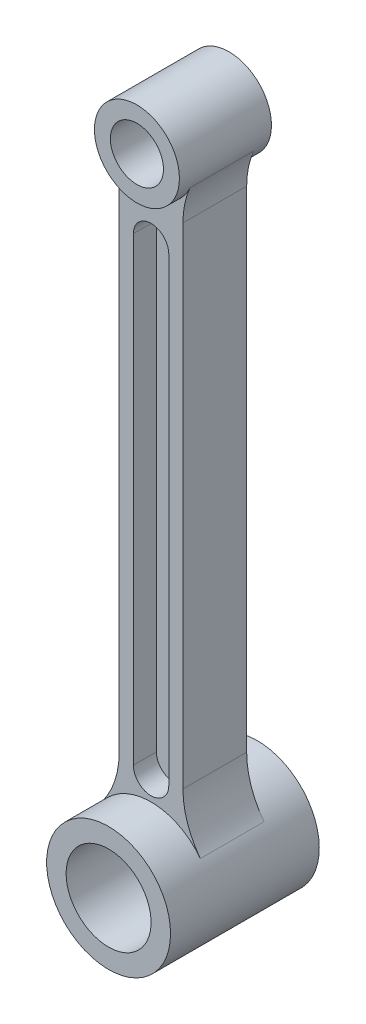
ISO-10303-21;
HEADER;
FILE_DESCRIPTION(('STEP AP214'),'2;1');
FILE_NAME('part.step','',(''),(''),'','','');
FILE_SCHEMA(('AUTOMOTIVE_DESIGN { 1 0 10303 214 1 1 1 1 }'));
ENDSEC;
DATA;
#1=APPLICATION_CONTEXT('core data for automotive mechanical design processes');
#2=APPLICATION_PROTOCOL_DEFINITION('international standard','automotive_design',2000,#1);
#3=PRODUCT_CONTEXT('',#1,'mechanical');
#4=PRODUCT('Part','Part','',(#3));
#5=PRODUCT_RELATED_PRODUCT_CATEGORY('part','',(#4));
#6=PRODUCT_DEFINITION_FORMATION('','',#4);
#7=PRODUCT_DEFINITION_CONTEXT('part definition',#1,'design');
#8=PRODUCT_DEFINITION('design','',#6,#7);
#9=PRODUCT_DEFINITION_SHAPE('','',#8);
#10=(LENGTH_UNIT() NAMED_UNIT(*) SI_UNIT(.MILLI.,.METRE.));
#11=(NAMED_UNIT(*) PLANE_ANGLE_UNIT() SI_UNIT($,.RADIAN.));
#12=(NAMED_UNIT(*) SI_UNIT($,.STERADIAN.) SOLID_ANGLE_UNIT());
#13=UNCERTAINTY_MEASURE_WITH_UNIT(LENGTH_MEASURE(1.E-05),#10,'distance_accuracy_value','');
#14=(GEOMETRIC_REPRESENTATION_CONTEXT(3) GLOBAL_UNCERTAINTY_ASSIGNED_CONTEXT((#13)) GLOBAL_UNIT_ASSIGNED_CONTEXT((#10,
#11,#12)) REPRESENTATION_CONTEXT('',''));
#15=CARTESIAN_POINT('',(0.,0.,0.));
#16=DIRECTION('',(0.,0.,1.));
#17=DIRECTION('',(1.,0.,0.));
#18=AXIS2_PLACEMENT_3D('',#15,#16,#17);
#19=CARTESIAN_POINT('',(0.,154.,9.));
#20=DIRECTION('',(0.,0.,-1.));
#21=DIRECTION('',(-1.,0.,0.));
#22=AXIS2_PLACEMENT_3D('',#19,#20,#21);
#23=CYLINDRICAL_SURFACE('',#22,5.);
#24=DIRECTION('',(0.,0.,-1.));
#25=VECTOR('',#24,1.);
#26=CARTESIAN_POINT('',(4.99999999999998,154.,9.));
#27=LINE('',#26,#25);
#28=CARTESIAN_POINT('',(4.99999999999998,154.,-2.5));
#29=VERTEX_POINT('',#28);
#30=CARTESIAN_POINT('',(4.99999999999998,154.,-9.));
#31=VERTEX_POINT('',#30);
#32=EDGE_CURVE('E182',#29,#31,#27,.T.);
#33=ORIENTED_EDGE('',*,*,#32,.F.);
#34=CARTESIAN_POINT('',(0.,154.,-2.5));
#35=DIRECTION('',(0.,0.,1.));
#36=DIRECTION('',(1.,0.,0.));
#37=AXIS2_PLACEMENT_3D('',#34,#35,#36);
#38=CIRCLE('',#37,5.);
#39=CARTESIAN_POINT('',(-5.00000000000002,154.,-2.5));
#40=VERTEX_POINT('',#39);
#41=EDGE_CURVE('E581',#29,#40,#38,.T.);
#42=ORIENTED_EDGE('',*,*,#41,.T.);
#43=DIRECTION('',(0.,0.,-1.));
#44=VECTOR('',#43,1.);
#45=CARTESIAN_POINT('',(-5.00000000000002,154.,9.));
#46=LINE('',#45,#44);
#47=CARTESIAN_POINT('',(-5.00000000000002,154.,-9.));
#48=VERTEX_POINT('',#47);
#49=EDGE_CURVE('E210',#40,#48,#46,.T.);
#50=ORIENTED_EDGE('',*,*,#49,.T.);
#51=CARTESIAN_POINT('',(0.,154.,-9.));
#52=DIRECTION('',(0.,0.,1.));
#53=DIRECTION('',(1.,0.,0.));
#54=AXIS2_PLACEMENT_3D('',#51,#52,#53);
#55=CIRCLE('',#54,5.);
#56=EDGE_CURVE('E232',#31,#48,#55,.T.);
#57=ORIENTED_EDGE('',*,*,#56,.F.);
#58=EDGE_LOOP('',(#33,#42,#50,#57));
#59=FACE_BOUND('',#58,.T.);
#60=ADVANCED_FACE('F41',(#59),#23,.F.);
#61=CARTESIAN_POINT('',(5.,0.,9.));
#62=DIRECTION('',(-1.,0.,0.));
#63=DIRECTION('',(0.,-1.,0.));
#64=AXIS2_PLACEMENT_3D('',#61,#62,#63);
#65=PLANE('',#64);
#66=DIRECTION('',(0.,0.,-1.));
#67=VECTOR('',#66,1.);
#68=CARTESIAN_POINT('',(5.,24.,9.));
#69=LINE('',#68,#67);
#70=CARTESIAN_POINT('',(5.,24.,-2.5));
#71=VERTEX_POINT('',#70);
#72=CARTESIAN_POINT('',(5.,24.,-9.));
#73=VERTEX_POINT('',#72);
#74=EDGE_CURVE('E213',#71,#73,#69,.T.);
#75=ORIENTED_EDGE('',*,*,#74,.F.);
#76=DIRECTION('',(0.,1.,0.));
#77=VECTOR('',#76,1.);
#78=CARTESIAN_POINT('',(5.,0.,-2.5));
#79=LINE('',#78,#77);
#80=EDGE_CURVE('E58',#71,#29,#79,.T.);
#81=ORIENTED_EDGE('',*,*,#80,.T.);
#82=ORIENTED_EDGE('',*,*,#32,.T.);
#83=DIRECTION('',(0.,1.,0.));
#84=VECTOR('',#83,1.);
#85=CARTESIAN_POINT('',(5.,0.,-9.));
#86=LINE('',#85,#84);
#87=EDGE_CURVE('E237',#73,#31,#86,.T.);
#88=ORIENTED_EDGE('',*,*,#87,.F.);
#89=EDGE_LOOP('',(#75,#81,#82,#88));
#90=FACE_BOUND('',#89,.T.);
#91=ADVANCED_FACE('F355',(#90),#65,.T.);
#92=CARTESIAN_POINT('',(0.,24.,9.));
#93=DIRECTION('',(0.,0.,-1.));
#94=DIRECTION('',(-1.,0.,0.));
#95=AXIS2_PLACEMENT_3D('',#92,#93,#94);
#96=CYLINDRICAL_SURFACE('',#95,5.);
#97=DIRECTION('',(0.,0.,-1.));
#98=VECTOR('',#97,1.);
#99=CARTESIAN_POINT('',(-5.,24.,9.));
#100=LINE('',#99,#98);
#101=CARTESIAN_POINT('',(-5.,24.,-2.5));
#102=VERTEX_POINT('',#101);
#103=CARTESIAN_POINT('',(-5.,24.,-9.));
#104=VERTEX_POINT('',#103);
#105=EDGE_CURVE('E209',#102,#104,#100,.T.);
#106=ORIENTED_EDGE('',*,*,#105,.F.);
#107=CARTESIAN_POINT('',(0.,24.,-2.5));
#108=DIRECTION('',(0.,0.,1.));
#109=DIRECTION('',(1.,0.,0.));
#110=AXIS2_PLACEMENT_3D('',#107,#108,#109);
#111=CIRCLE('',#110,5.);
#112=EDGE_CURVE('E66',#102,#71,#111,.T.);
#113=ORIENTED_EDGE('',*,*,#112,.T.);
#114=ORIENTED_EDGE('',*,*,#74,.T.);
#115=CARTESIAN_POINT('',(0.,24.,-9.));
#116=DIRECTION('',(0.,0.,1.));
#117=DIRECTION('',(1.,0.,0.));
#118=AXIS2_PLACEMENT_3D('',#115,#116,#117);
#119=CIRCLE('',#118,5.);
#120=EDGE_CURVE('E230',#104,#73,#119,.T.);
#121=ORIENTED_EDGE('',*,*,#120,.F.);
#122=EDGE_LOOP('',(#106,#113,#114,#121));
#123=FACE_BOUND('',#122,.T.);
#124=ADVANCED_FACE('F235',(#123),#96,.F.);
#125=CARTESIAN_POINT('',(-5.,0.,9.));
#126=DIRECTION('',(-1.,0.,0.));
#127=DIRECTION('',(0.,-1.,0.));
#128=AXIS2_PLACEMENT_3D('',#125,#126,#127);
#129=PLANE('',#128);
#130=DIRECTION('',(0.,1.,0.));
#131=VECTOR('',#130,1.);
#132=CARTESIAN_POINT('',(-5.,0.,-2.5));
#133=LINE('',#132,#131);
#134=EDGE_CURVE('E223',#102,#40,#133,.T.);
#135=ORIENTED_EDGE('',*,*,#134,.F.);
#136=ORIENTED_EDGE('',*,*,#105,.T.);
#137=DIRECTION('',(0.,1.,0.));
#138=VECTOR('',#137,1.);
#139=CARTESIAN_POINT('',(-5.,0.,-9.));
#140=LINE('',#139,#138);
#141=EDGE_CURVE('E220',#104,#48,#140,.T.);
#142=ORIENTED_EDGE('',*,*,#141,.T.);
#143=ORIENTED_EDGE('',*,*,#49,.F.);
#144=EDGE_LOOP('',(#135,#136,#142,#143));
#145=FACE_BOUND('',#144,.T.);
#146=ADVANCED_FACE('F219',(#145),#129,.F.);
#147=CARTESIAN_POINT('',(0.,0.,21.));
#148=DIRECTION('',(0.,0.,-1.));
#149=DIRECTION('',(-1.,0.,0.));
#150=AXIS2_PLACEMENT_3D('',#147,#148,#149);
#151=CYLINDRICAL_SURFACE('',#150,12.);
#152=CARTESIAN_POINT('',(0.,0.,21.));
#153=DIRECTION('',(0.,0.,1.));
#154=DIRECTION('',(1.,0.,0.));
#155=AXIS2_PLACEMENT_3D('',#152,#153,#154);
#156=CIRCLE('',#155,12.);
#157=CARTESIAN_POINT('',(-12.,0.,21.));
#158=VERTEX_POINT('',#157);
#159=EDGE_CURVE('E50',#158,#158,#156,.T.);
#160=CARTESIAN_POINT('',(0.,0.,-21.));
#161=DIRECTION('',(0.,0.,1.));
#162=DIRECTION('',(1.,0.,0.));
#163=AXIS2_PLACEMENT_3D('',#160,#161,#162);
#164=CIRCLE('',#163,12.);
#165=CARTESIAN_POINT('',(-12.,0.,-21.));
#166=VERTEX_POINT('',#165);
#167=EDGE_CURVE('E192',#166,#166,#164,.T.);
#168=CARTESIAN_POINT('',(-12.,0.,21.));
#169=CARTESIAN_POINT('',(-12.,0.,20.5625));
#170=CARTESIAN_POINT('',(-12.,0.,20.125));
#171=CARTESIAN_POINT('',(-12.,0.,19.25));
#172=CARTESIAN_POINT('',(-12.,0.,18.8125));
#173=CARTESIAN_POINT('',(-12.,0.,17.9375));
#174=CARTESIAN_POINT('',(-12.,0.,17.5));
#175=CARTESIAN_POINT('',(-12.,0.,16.625));
#176=CARTESIAN_POINT('',(-12.,0.,16.1875));
#177=CARTESIAN_POINT('',(-12.,0.,15.3125));
#178=CARTESIAN_POINT('',(-12.,0.,14.875));
#179=CARTESIAN_POINT('',(-12.,0.,14.));
#180=CARTESIAN_POINT('',(-12.,0.,13.5625));
#181=CARTESIAN_POINT('',(-12.,0.,12.6875));
#182=CARTESIAN_POINT('',(-12.,0.,12.25));
#183=CARTESIAN_POINT('',(-12.,0.,11.375));
#184=CARTESIAN_POINT('',(-12.,0.,10.9375));
#185=CARTESIAN_POINT('',(-12.,0.,10.0625));
#186=CARTESIAN_POINT('',(-12.,0.,9.625));
#187=CARTESIAN_POINT('',(-12.,0.,8.75));
#188=CARTESIAN_POINT('',(-12.,0.,8.3125));
#189=CARTESIAN_POINT('',(-12.,0.,7.4375));
#190=CARTESIAN_POINT('',(-12.,0.,7.));
#191=CARTESIAN_POINT('',(-12.,0.,6.125));
#192=CARTESIAN_POINT('',(-12.,0.,5.6875));
#193=CARTESIAN_POINT('',(-12.,0.,4.8125));
#194=CARTESIAN_POINT('',(-12.,0.,4.375));
#195=CARTESIAN_POINT('',(-12.,0.,3.5));
#196=CARTESIAN_POINT('',(-12.,0.,3.0625));
#197=CARTESIAN_POINT('',(-12.,0.,2.1875));
#198=CARTESIAN_POINT('',(-12.,0.,1.75));
#199=CARTESIAN_POINT('',(-12.,0.,0.874999999999997));
#200=CARTESIAN_POINT('',(-12.,0.,0.437499999999997));
#201=CARTESIAN_POINT('',(-12.,0.,-0.437500000000004));
#202=CARTESIAN_POINT('',(-12.,0.,-0.875000000000004));
#203=CARTESIAN_POINT('',(-12.,0.,-1.75000000000001));
#204=CARTESIAN_POINT('',(-12.,0.,-2.18750000000001));
#205=CARTESIAN_POINT('',(-12.,0.,-3.0625));
#206=CARTESIAN_POINT('',(-12.,0.,-3.5));
#207=CARTESIAN_POINT('',(-12.,0.,-4.375));
#208=CARTESIAN_POINT('',(-12.,0.,-4.8125));
#209=CARTESIAN_POINT('',(-12.,0.,-5.68750000000001));
#210=CARTESIAN_POINT('',(-12.,0.,-6.12500000000001));
#211=CARTESIAN_POINT('',(-12.,0.,-7.00000000000001));
#212=CARTESIAN_POINT('',(-12.,0.,-7.4375));
#213=CARTESIAN_POINT('',(-12.,0.,-8.3125));
#214=CARTESIAN_POINT('',(-12.,0.,-8.75));
#215=CARTESIAN_POINT('',(-12.,0.,-9.625));
#216=CARTESIAN_POINT('',(-12.,0.,-10.0625));
#217=CARTESIAN_POINT('',(-12.,0.,-10.9375));
#218=CARTESIAN_POINT('',(-12.,0.,-11.375));
#219=CARTESIAN_POINT('',(-12.,0.,-12.25));
#220=CARTESIAN_POINT('',(-12.,0.,-12.6875));
#221=CARTESIAN_POINT('',(-12.,0.,-13.5625));
#222=CARTESIAN_POINT('',(-12.,0.,-14.));
#223=CARTESIAN_POINT('',(-12.,0.,-14.875));
#224=CARTESIAN_POINT('',(-12.,0.,-15.3125));
#225=CARTESIAN_POINT('',(-12.,0.,-16.1875));
#226=CARTESIAN_POINT('',(-12.,0.,-16.625));
#227=CARTESIAN_POINT('',(-12.,0.,-17.5));
#228=CARTESIAN_POINT('',(-12.,0.,-17.9375));
#229=CARTESIAN_POINT('',(-12.,0.,-18.8125));
#230=CARTESIAN_POINT('',(-12.,0.,-19.25));
#231=CARTESIAN_POINT('',(-12.,0.,-20.125));
#232=CARTESIAN_POINT('',(-12.,0.,-20.5625));
#233=CARTESIAN_POINT('',(-12.,0.,-21.));
#234=B_SPLINE_CURVE_WITH_KNOTS('',3,(#168,#169,#170,#171,#172,#173,#174,#175,#176,#177,#178,
#179,#180,#181,#182,#183,#184,#185,#186,#187,#188,#189,#190,#191,#192,#193,#194,#195,#196,#197,
#198,#199,#200,#201,#202,#203,#204,#205,#206,#207,#208,#209,#210,#211,#212,#213,#214,#215,#216,
#217,#218,#219,#220,#221,#222,#223,#224,#225,#226,#227,#228,#229,#230,#231,#232,#233),
.UNSPECIFIED.,.F.,.F.,(4,2,2,2,2,2,2,2,2,2,2,2,2,2,2,2,2,2,2,2,2,2,2,2,2,2,2,2,2,2,2,2,4),(0.,
1.3125,2.625,3.9375,5.25,6.5625,7.875,9.1875,10.5,11.8125,13.125,14.4375,15.75,17.0625,18.375,
19.6875,21.,22.3125,23.625,24.9375,26.25,27.5625,28.875,30.1875,31.5,32.8125,34.125,35.4375,
36.75,38.0625,39.375,40.6875,42.),.UNSPECIFIED.);
#235=EDGE_CURVE('BSEAM43',#158,#166,#234,.T.);
#236=ORIENTED_EDGE('',*,*,#159,.T.);
#237=ORIENTED_EDGE('',*,*,#167,.F.);
#238=ORIENTED_EDGE('',*,*,#235,.T.);
#239=ORIENTED_EDGE('',*,*,#235,.F.);
#240=EDGE_LOOP('',(#236,#238,#237,#239));
#241=FACE_BOUND('',#240,.T.);
#242=ADVANCED_FACE('F43',(#241),#151,.F.);
#243=CARTESIAN_POINT('',(0.,0.,21.));
#244=DIRECTION('',(0.,0.,-1.));
#245=DIRECTION('',(-1.,0.,0.));
#246=AXIS2_PLACEMENT_3D('',#243,#244,#245);
#247=CYLINDRICAL_SURFACE('',#246,17.5);
#248=DIRECTION('',(0.,0.,-1.));
#249=VECTOR('',#248,1.);
#250=CARTESIAN_POINT('',(13.9156626506024,10.6115188825459,9.));
#251=LINE('',#250,#249);
#252=CARTESIAN_POINT('',(13.9156626506024,10.6115188825459,9.));
#253=VERTEX_POINT('',#252);
#254=CARTESIAN_POINT('',(13.9156626506024,10.6115188825459,-9.));
#255=VERTEX_POINT('',#254);
#256=EDGE_CURVE('E185',#253,#255,#251,.T.);
#257=ORIENTED_EDGE('',*,*,#256,.F.);
#258=CARTESIAN_POINT('',(0.,0.,9.));
#259=DIRECTION('',(0.,0.,1.));
#260=DIRECTION('',(1.,0.,0.));
#261=AXIS2_PLACEMENT_3D('',#258,#259,#260);
#262=CIRCLE('',#261,17.5);
#263=CARTESIAN_POINT('',(-13.9156626506024,10.611518882546,9.));
#264=VERTEX_POINT('',#263);
#265=EDGE_CURVE('E302',#253,#264,#262,.T.);
#266=ORIENTED_EDGE('',*,*,#265,.T.);
#267=DIRECTION('',(0.,0.,-1.));
#268=VECTOR('',#267,1.);
#269=CARTESIAN_POINT('',(-13.9156626506024,10.6115188825459,9.));
#270=LINE('',#269,#268);
#271=CARTESIAN_POINT('',(-13.9156626506024,10.6115188825459,-9.));
#272=VERTEX_POINT('',#271);
#273=EDGE_CURVE('E265',#264,#272,#270,.T.);
#274=ORIENTED_EDGE('',*,*,#273,.T.);
#275=CARTESIAN_POINT('',(0.,0.,-9.));
#276=DIRECTION('',(0.,0.,1.));
#277=DIRECTION('',(1.,0.,0.));
#278=AXIS2_PLACEMENT_3D('',#275,#276,#277);
#279=CIRCLE('',#278,17.5);
#280=EDGE_CURVE('E257',#255,#272,#279,.T.);
#281=ORIENTED_EDGE('',*,*,#280,.F.);
#282=EDGE_LOOP('',(#257,#266,#274,#281));
#283=FACE_BOUND('',#282,.T.);
#284=CARTESIAN_POINT('',(0.,0.,21.));
#285=DIRECTION('',(0.,0.,1.));
#286=DIRECTION('',(1.,0.,0.));
#287=AXIS2_PLACEMENT_3D('',#284,#285,#286);
#288=CIRCLE('',#287,17.5);
#289=CARTESIAN_POINT('',(17.5,0.,21.));
#290=VERTEX_POINT('',#289);
#291=EDGE_CURVE('E11',#290,#290,#288,.T.);
#292=ORIENTED_EDGE('',*,*,#291,.F.);
#293=EDGE_LOOP('',(#292));
#294=FACE_BOUND('',#293,.T.);
#295=CARTESIAN_POINT('',(0.,0.,-21.));
#296=DIRECTION('',(0.,0.,1.));
#297=DIRECTION('',(1.,0.,0.));
#298=AXIS2_PLACEMENT_3D('',#295,#296,#297);
#299=CIRCLE('',#298,17.5);
#300=CARTESIAN_POINT('',(17.5,0.,-21.));
#301=VERTEX_POINT('',#300);
#302=EDGE_CURVE('E45',#301,#301,#299,.T.);
#303=ORIENTED_EDGE('',*,*,#302,.T.);
#304=EDGE_LOOP('',(#303));
#305=FACE_BOUND('',#304,.T.);
#306=ADVANCED_FACE('F404',(#283,#294,#305),#247,.T.);
#307=CARTESIAN_POINT('',(0.,0.,21.));
#308=DIRECTION('',(0.,0.,1.));
#309=DIRECTION('',(1.,0.,0.));
#310=AXIS2_PLACEMENT_3D('',#307,#308,#309);
#311=PLANE('',#310);
#312=ORIENTED_EDGE('',*,*,#159,.F.);
#313=EDGE_LOOP('',(#312));
#314=FACE_BOUND('',#313,.T.);
#315=ORIENTED_EDGE('',*,*,#291,.T.);
#316=EDGE_LOOP('',(#315));
#317=FACE_BOUND('',#316,.T.);
#318=ADVANCED_FACE('F410',(#314,#317),#311,.T.);
#319=CARTESIAN_POINT('',(0.,0.,-21.));
#320=DIRECTION('',(0.,0.,1.));
#321=DIRECTION('',(1.,0.,0.));
#322=AXIS2_PLACEMENT_3D('',#319,#320,#321);
#323=PLANE('',#322);
#324=ORIENTED_EDGE('',*,*,#167,.T.);
#325=EDGE_LOOP('',(#324));
#326=FACE_BOUND('',#325,.T.);
#327=ORIENTED_EDGE('',*,*,#302,.F.);
#328=EDGE_LOOP('',(#327));
#329=FACE_BOUND('',#328,.T.);
#330=ADVANCED_FACE('F389',(#326,#329),#323,.F.);
#331=CARTESIAN_POINT('',(9.,0.,9.));
#332=DIRECTION('',(-1.,0.,0.));
#333=DIRECTION('',(0.,0.,1.));
#334=AXIS2_PLACEMENT_3D('',#331,#332,#333);
#335=PLANE('',#334);
#336=DIRECTION('',(0.,1.,0.));
#337=VECTOR('',#336,1.);
#338=CARTESIAN_POINT('',(9.,0.,-9.));
#339=LINE('',#338,#337);
#340=CARTESIAN_POINT('',(9.,25.1644590643232,-9.));
#341=VERTEX_POINT('',#340);
#342=CARTESIAN_POINT('',(9.,163.612505430062,-9.));
#343=VERTEX_POINT('',#342);
#344=EDGE_CURVE('E233',#341,#343,#339,.T.);
#345=ORIENTED_EDGE('',*,*,#344,.T.);
#346=DIRECTION('',(0.,0.,-1.));
#347=VECTOR('',#346,1.);
#348=CARTESIAN_POINT('',(9.,163.612505430062,9.));
#349=LINE('',#348,#347);
#350=CARTESIAN_POINT('',(9.,163.612505430062,9.));
#351=VERTEX_POINT('',#350);
#352=EDGE_CURVE('E194',#351,#343,#349,.T.);
#353=ORIENTED_EDGE('',*,*,#352,.F.);
#354=DIRECTION('',(0.,1.,0.));
#355=VECTOR('',#354,1.);
#356=CARTESIAN_POINT('',(9.,0.,9.));
#357=LINE('',#356,#355);
#358=CARTESIAN_POINT('',(9.,25.1644590643232,9.));
#359=VERTEX_POINT('',#358);
#360=EDGE_CURVE('E328',#359,#351,#357,.T.);
#361=ORIENTED_EDGE('',*,*,#360,.F.);
#362=DIRECTION('',(0.,0.,-1.));
#363=VECTOR('',#362,1.);
#364=CARTESIAN_POINT('',(9.,25.1644590643232,9.));
#365=LINE('',#364,#363);
#366=EDGE_CURVE('E181',#359,#341,#365,.T.);
#367=ORIENTED_EDGE('',*,*,#366,.T.);
#368=EDGE_LOOP('',(#345,#353,#361,#367));
#369=FACE_BOUND('',#368,.T.);
#370=ADVANCED_FACE('F386',(#369),#335,.F.);
#371=CARTESIAN_POINT('',(33.,163.612505430062,9.));
#372=DIRECTION('',(0.,0.,-1.));
#373=DIRECTION('',(-1.,0.,0.));
#374=AXIS2_PLACEMENT_3D('',#371,#372,#373);
#375=CYLINDRICAL_SURFACE('',#374,24.);
#376=CARTESIAN_POINT('',(33.,163.612505430062,-9.));
#377=DIRECTION('',(0.,0.,1.));
#378=DIRECTION('',(1.,0.,0.));
#379=AXIS2_PLACEMENT_3D('',#376,#377,#378);
#380=CIRCLE('',#379,24.);
#381=CARTESIAN_POINT('',(11.,173.204168476687,-9.));
#382=VERTEX_POINT('',#381);
#383=EDGE_CURVE('E243',#343,#382,#380,.F.);
#384=ORIENTED_EDGE('',*,*,#383,.T.);
#385=DIRECTION('',(0.,0.,-1.));
#386=VECTOR('',#385,1.);
#387=CARTESIAN_POINT('',(11.,173.204168476687,9.));
#388=LINE('',#387,#386);
#389=CARTESIAN_POINT('',(11.,173.204168476687,9.));
#390=VERTEX_POINT('',#389);
#391=EDGE_CURVE('E199',#390,#382,#388,.T.);
#392=ORIENTED_EDGE('',*,*,#391,.F.);
#393=CARTESIAN_POINT('',(33.,163.612505430062,9.));
#394=DIRECTION('',(0.,0.,1.));
#395=DIRECTION('',(1.,0.,0.));
#396=AXIS2_PLACEMENT_3D('',#393,#394,#395);
#397=CIRCLE('',#396,24.);
#398=EDGE_CURVE('E297',#351,#390,#397,.F.);
#399=ORIENTED_EDGE('',*,*,#398,.F.);
#400=ORIENTED_EDGE('',*,*,#352,.T.);
#401=EDGE_LOOP('',(#384,#392,#399,#400));
#402=FACE_BOUND('',#401,.T.);
#403=ADVANCED_FACE('F331',(#402),#375,.F.);
#404=CARTESIAN_POINT('',(-33.,163.612505430062,9.));
#405=DIRECTION('',(0.,0.,-1.));
#406=DIRECTION('',(-1.,0.,0.));
#407=AXIS2_PLACEMENT_3D('',#404,#405,#406);
#408=CYLINDRICAL_SURFACE('',#407,24.);
#409=CARTESIAN_POINT('',(-33.,163.612505430062,-9.));
#410=DIRECTION('',(0.,0.,1.));
#411=DIRECTION('',(1.,0.,0.));
#412=AXIS2_PLACEMENT_3D('',#409,#410,#411);
#413=CIRCLE('',#412,24.);
#414=CARTESIAN_POINT('',(-9.,163.612505430062,-9.));
#415=VERTEX_POINT('',#414);
#416=CARTESIAN_POINT('',(-11.,173.204168476687,-9.));
#417=VERTEX_POINT('',#416);
#418=EDGE_CURVE('E248',#415,#417,#413,.T.);
#419=ORIENTED_EDGE('',*,*,#418,.F.);
#420=DIRECTION('',(0.,0.,-1.));
#421=VECTOR('',#420,1.);
#422=CARTESIAN_POINT('',(-9.,163.612505430062,9.));
#423=LINE('',#422,#421);
#424=CARTESIAN_POINT('',(-9.,163.612505430062,9.));
#425=VERTEX_POINT('',#424);
#426=EDGE_CURVE('E269',#425,#415,#423,.T.);
#427=ORIENTED_EDGE('',*,*,#426,.F.);
#428=CARTESIAN_POINT('',(-33.,163.612505430062,9.));
#429=DIRECTION('',(0.,0.,1.));
#430=DIRECTION('',(1.,0.,0.));
#431=AXIS2_PLACEMENT_3D('',#428,#429,#430);
#432=CIRCLE('',#431,24.);
#433=CARTESIAN_POINT('',(-11.,173.204168476687,9.));
#434=VERTEX_POINT('',#433);
#435=EDGE_CURVE('E276',#425,#434,#432,.T.);
#436=ORIENTED_EDGE('',*,*,#435,.T.);
#437=DIRECTION('',(0.,0.,-1.));
#438=VECTOR('',#437,1.);
#439=CARTESIAN_POINT('',(-11.,173.204168476687,9.));
#440=LINE('',#439,#438);
#441=EDGE_CURVE('E205',#434,#417,#440,.T.);
#442=ORIENTED_EDGE('',*,*,#441,.T.);
#443=EDGE_LOOP('',(#419,#427,#436,#442));
#444=FACE_BOUND('',#443,.T.);
#445=ADVANCED_FACE('F274',(#444),#408,.F.);
#446=CARTESIAN_POINT('',(-9.,0.,9.));
#447=DIRECTION('',(-1.,0.,0.));
#448=DIRECTION('',(0.,0.,1.));
#449=AXIS2_PLACEMENT_3D('',#446,#447,#448);
#450=PLANE('',#449);
#451=DIRECTION('',(0.,1.,0.));
#452=VECTOR('',#451,1.);
#453=CARTESIAN_POINT('',(-9.,0.,-9.));
#454=LINE('',#453,#452);
#455=CARTESIAN_POINT('',(-9.,25.1644590643232,-9.));
#456=VERTEX_POINT('',#455);
#457=EDGE_CURVE('E251',#456,#415,#454,.T.);
#458=ORIENTED_EDGE('',*,*,#457,.F.);
#459=DIRECTION('',(0.,0.,-1.));
#460=VECTOR('',#459,1.);
#461=CARTESIAN_POINT('',(-9.,25.1644590643232,9.));
#462=LINE('',#461,#460);
#463=CARTESIAN_POINT('',(-9.,25.1644590643232,9.));
#464=VERTEX_POINT('',#463);
#465=EDGE_CURVE('E267',#464,#456,#462,.T.);
#466=ORIENTED_EDGE('',*,*,#465,.F.);
#467=DIRECTION('',(0.,1.,0.));
#468=VECTOR('',#467,1.);
#469=CARTESIAN_POINT('',(-9.,0.,9.));
#470=LINE('',#469,#468);
#471=EDGE_CURVE('E286',#464,#425,#470,.T.);
#472=ORIENTED_EDGE('',*,*,#471,.T.);
#473=ORIENTED_EDGE('',*,*,#426,.T.);
#474=EDGE_LOOP('',(#458,#466,#472,#473));
#475=FACE_BOUND('',#474,.T.);
#476=ADVANCED_FACE('F283',(#475),#450,.T.);
#477=CARTESIAN_POINT('',(-33.,25.1644590643232,9.));
#478=DIRECTION('',(0.,0.,-1.));
#479=DIRECTION('',(-1.,0.,0.));
#480=AXIS2_PLACEMENT_3D('',#477,#478,#479);
#481=CYLINDRICAL_SURFACE('',#480,24.);
#482=CARTESIAN_POINT('',(-33.,25.1644590643232,-9.));
#483=DIRECTION('',(0.,0.,1.));
#484=DIRECTION('',(1.,0.,0.));
#485=AXIS2_PLACEMENT_3D('',#482,#483,#484);
#486=CIRCLE('',#485,24.);
#487=EDGE_CURVE('E254',#272,#456,#486,.T.);
#488=ORIENTED_EDGE('',*,*,#487,.F.);
#489=ORIENTED_EDGE('',*,*,#273,.F.);
#490=CARTESIAN_POINT('',(-33.,25.1644590643232,9.));
#491=DIRECTION('',(0.,0.,1.));
#492=DIRECTION('',(1.,0.,0.));
#493=AXIS2_PLACEMENT_3D('',#490,#491,#492);
#494=CIRCLE('',#493,24.);
#495=EDGE_CURVE('E295',#264,#464,#494,.T.);
#496=ORIENTED_EDGE('',*,*,#495,.T.);
#497=ORIENTED_EDGE('',*,*,#465,.T.);
#498=EDGE_LOOP('',(#488,#489,#496,#497));
#499=FACE_BOUND('',#498,.T.);
#500=ADVANCED_FACE('F364',(#499),#481,.F.);
#501=CARTESIAN_POINT('',(0.,154.,2.5));
#502=DIRECTION('',(0.,0.,1.));
#503=DIRECTION('',(1.,0.,0.));
#504=AXIS2_PLACEMENT_3D('',#501,#502,#503);
#505=CIRCLE('',#504,5.);
#506=CARTESIAN_POINT('',(4.99999999999998,154.,2.5));
#507=VERTEX_POINT('',#506);
#508=CARTESIAN_POINT('',(-5.00000000000002,154.,2.5));
#509=VERTEX_POINT('',#508);
#510=EDGE_CURVE('E159',#507,#509,#505,.T.);
#511=ORIENTED_EDGE('',*,*,#510,.F.);
#512=CARTESIAN_POINT('',(4.99999999999998,154.,9.));
#513=VERTEX_POINT('',#512);
#514=EDGE_CURVE('E171',#513,#507,#27,.T.);
#515=ORIENTED_EDGE('',*,*,#514,.F.);
#516=CARTESIAN_POINT('',(0.,154.,9.));
#517=DIRECTION('',(0.,0.,1.));
#518=DIRECTION('',(1.,0.,0.));
#519=AXIS2_PLACEMENT_3D('',#516,#517,#518);
#520=CIRCLE('',#519,5.);
#521=CARTESIAN_POINT('',(-5.00000000000002,154.,9.));
#522=VERTEX_POINT('',#521);
#523=EDGE_CURVE('E261',#513,#522,#520,.T.);
#524=ORIENTED_EDGE('',*,*,#523,.T.);
#525=EDGE_CURVE('E174',#522,#509,#46,.T.);
#526=ORIENTED_EDGE('',*,*,#525,.T.);
#527=EDGE_LOOP('',(#511,#515,#524,#526));
#528=FACE_BOUND('',#527,.T.);
#529=ADVANCED_FACE('F169',(#528),#23,.F.);
#530=DIRECTION('',(0.,1.,0.));
#531=VECTOR('',#530,1.);
#532=CARTESIAN_POINT('',(5.,0.,2.5));
#533=LINE('',#532,#531);
#534=CARTESIAN_POINT('',(5.,24.,2.5));
#535=VERTEX_POINT('',#534);
#536=EDGE_CURVE('E156',#535,#507,#533,.T.);
#537=ORIENTED_EDGE('',*,*,#536,.F.);
#538=CARTESIAN_POINT('',(5.,24.,9.));
#539=VERTEX_POINT('',#538);
#540=EDGE_CURVE('E187',#539,#535,#69,.T.);
#541=ORIENTED_EDGE('',*,*,#540,.F.);
#542=DIRECTION('',(0.,1.,0.));
#543=VECTOR('',#542,1.);
#544=CARTESIAN_POINT('',(5.,0.,9.));
#545=LINE('',#544,#543);
#546=EDGE_CURVE('E180',#539,#513,#545,.T.);
#547=ORIENTED_EDGE('',*,*,#546,.T.);
#548=ORIENTED_EDGE('',*,*,#514,.T.);
#549=EDGE_LOOP('',(#537,#541,#547,#548));
#550=FACE_BOUND('',#549,.T.);
#551=ADVANCED_FACE('F178',(#550),#65,.T.);
#552=CARTESIAN_POINT('',(0.,24.,2.5));
#553=DIRECTION('',(0.,0.,1.));
#554=DIRECTION('',(1.,0.,0.));
#555=AXIS2_PLACEMENT_3D('',#552,#553,#554);
#556=CIRCLE('',#555,5.);
#557=CARTESIAN_POINT('',(-5.,24.,2.5));
#558=VERTEX_POINT('',#557);
#559=EDGE_CURVE('E162',#558,#535,#556,.T.);
#560=ORIENTED_EDGE('',*,*,#559,.F.);
#561=CARTESIAN_POINT('',(-5.,24.,9.));
#562=VERTEX_POINT('',#561);
#563=EDGE_CURVE('E211',#562,#558,#100,.T.);
#564=ORIENTED_EDGE('',*,*,#563,.F.);
#565=CARTESIAN_POINT('',(0.,24.,9.));
#566=DIRECTION('',(0.,0.,1.));
#567=DIRECTION('',(1.,0.,0.));
#568=AXIS2_PLACEMENT_3D('',#565,#566,#567);
#569=CIRCLE('',#568,5.);
#570=EDGE_CURVE('E323',#562,#539,#569,.T.);
#571=ORIENTED_EDGE('',*,*,#570,.T.);
#572=ORIENTED_EDGE('',*,*,#540,.T.);
#573=EDGE_LOOP('',(#560,#564,#571,#572));
#574=FACE_BOUND('',#573,.T.);
#575=ADVANCED_FACE('F369',(#574),#96,.F.);
#576=ORIENTED_EDGE('',*,*,#563,.T.);
#577=DIRECTION('',(0.,1.,0.));
#578=VECTOR('',#577,1.);
#579=CARTESIAN_POINT('',(-5.,0.,2.5));
#580=LINE('',#579,#578);
#581=EDGE_CURVE('E175',#558,#509,#580,.T.);
#582=ORIENTED_EDGE('',*,*,#581,.T.);
#583=ORIENTED_EDGE('',*,*,#525,.F.);
#584=DIRECTION('',(0.,1.,0.));
#585=VECTOR('',#584,1.);
#586=CARTESIAN_POINT('',(-5.,0.,9.));
#587=LINE('',#586,#585);
#588=EDGE_CURVE('E326',#562,#522,#587,.T.);
#589=ORIENTED_EDGE('',*,*,#588,.F.);
#590=EDGE_LOOP('',(#576,#582,#583,#589));
#591=FACE_BOUND('',#590,.T.);
#592=ADVANCED_FACE('F391',(#591),#129,.F.);
#593=CARTESIAN_POINT('',(33.,25.1644590643232,9.));
#594=DIRECTION('',(0.,0.,-1.));
#595=DIRECTION('',(-1.,0.,0.));
#596=AXIS2_PLACEMENT_3D('',#593,#594,#595);
#597=CYLINDRICAL_SURFACE('',#596,24.);
#598=CARTESIAN_POINT('',(33.,25.1644590643232,-9.));
#599=DIRECTION('',(0.,0.,1.));
#600=DIRECTION('',(1.,0.,0.));
#601=AXIS2_PLACEMENT_3D('',#598,#599,#600);
#602=CIRCLE('',#601,24.);
#603=EDGE_CURVE('E260',#255,#341,#602,.F.);
#604=ORIENTED_EDGE('',*,*,#603,.T.);
#605=ORIENTED_EDGE('',*,*,#366,.F.);
#606=CARTESIAN_POINT('',(33.,25.1644590643232,9.));
#607=DIRECTION('',(0.,0.,1.));
#608=DIRECTION('',(1.,0.,0.));
#609=AXIS2_PLACEMENT_3D('',#606,#607,#608);
#610=CIRCLE('',#609,24.);
#611=EDGE_CURVE('E304',#253,#359,#610,.F.);
#612=ORIENTED_EDGE('',*,*,#611,.F.);
#613=ORIENTED_EDGE('',*,*,#256,.T.);
#614=EDGE_LOOP('',(#604,#605,#612,#613));
#615=FACE_BOUND('',#614,.T.);
#616=ADVANCED_FACE('F379',(#615),#597,.F.);
#617=CARTESIAN_POINT('',(0.,0.,9.));
#618=DIRECTION('',(0.,0.,1.));
#619=DIRECTION('',(1.,0.,0.));
#620=AXIS2_PLACEMENT_3D('',#617,#618,#619);
#621=PLANE('',#620);
#622=ORIENTED_EDGE('',*,*,#523,.F.);
#623=ORIENTED_EDGE('',*,*,#546,.F.);
#624=ORIENTED_EDGE('',*,*,#570,.F.);
#625=ORIENTED_EDGE('',*,*,#588,.T.);
#626=EDGE_LOOP('',(#622,#623,#624,#625));
#627=FACE_BOUND('',#626,.T.);
#628=ORIENTED_EDGE('',*,*,#360,.T.);
#629=ORIENTED_EDGE('',*,*,#398,.T.);
#630=CARTESIAN_POINT('',(0.,178.,9.));
#631=DIRECTION('',(0.,0.,1.));
#632=DIRECTION('',(1.,0.,0.));
#633=AXIS2_PLACEMENT_3D('',#630,#631,#632);
#634=CIRCLE('',#633,12.);
#635=EDGE_CURVE('E293',#434,#390,#634,.T.);
#636=ORIENTED_EDGE('',*,*,#635,.F.);
#637=ORIENTED_EDGE('',*,*,#435,.F.);
#638=ORIENTED_EDGE('',*,*,#471,.F.);
#639=ORIENTED_EDGE('',*,*,#495,.F.);
#640=ORIENTED_EDGE('',*,*,#265,.F.);
#641=ORIENTED_EDGE('',*,*,#611,.T.);
#642=EDGE_LOOP('',(#628,#629,#636,#637,#638,#639,#640,#641));
#643=FACE_BOUND('',#642,.T.);
#644=ADVANCED_FACE('F289',(#627,#643),#621,.T.);
#645=CARTESIAN_POINT('',(0.,0.,-9.));
#646=DIRECTION('',(0.,0.,1.));
#647=DIRECTION('',(1.,0.,0.));
#648=AXIS2_PLACEMENT_3D('',#645,#646,#647);
#649=PLANE('',#648);
#650=ORIENTED_EDGE('',*,*,#56,.T.);
#651=ORIENTED_EDGE('',*,*,#141,.F.);
#652=ORIENTED_EDGE('',*,*,#120,.T.);
#653=ORIENTED_EDGE('',*,*,#87,.T.);
#654=EDGE_LOOP('',(#650,#651,#652,#653));
#655=FACE_BOUND('',#654,.T.);
#656=ORIENTED_EDGE('',*,*,#344,.F.);
#657=ORIENTED_EDGE('',*,*,#603,.F.);
#658=ORIENTED_EDGE('',*,*,#280,.T.);
#659=ORIENTED_EDGE('',*,*,#487,.T.);
#660=ORIENTED_EDGE('',*,*,#457,.T.);
#661=ORIENTED_EDGE('',*,*,#418,.T.);
#662=CARTESIAN_POINT('',(0.,178.,-9.));
#663=DIRECTION('',(0.,0.,1.));
#664=DIRECTION('',(1.,0.,0.));
#665=AXIS2_PLACEMENT_3D('',#662,#663,#664);
#666=CIRCLE('',#665,12.);
#667=EDGE_CURVE('E245',#417,#382,#666,.T.);
#668=ORIENTED_EDGE('',*,*,#667,.T.);
#669=ORIENTED_EDGE('',*,*,#383,.F.);
#670=EDGE_LOOP('',(#656,#657,#658,#659,#660,#661,#668,#669));
#671=FACE_BOUND('',#670,.T.);
#672=ADVANCED_FACE('F227',(#655,#671),#649,.F.);
#673=CARTESIAN_POINT('',(0.,178.,13.));
#674=DIRECTION('',(0.,0.,-1.));
#675=DIRECTION('',(-1.,0.,0.));
#676=AXIS2_PLACEMENT_3D('',#673,#674,#675);
#677=CYLINDRICAL_SURFACE('',#676,7.50000000000001);
#678=CARTESIAN_POINT('',(0.,178.,13.));
#679=DIRECTION('',(0.,0.,1.));
#680=DIRECTION('',(1.,0.,0.));
#681=AXIS2_PLACEMENT_3D('',#678,#679,#680);
#682=CIRCLE('',#681,7.50000000000001);
#683=CARTESIAN_POINT('',(-7.50000000000001,178.,13.));
#684=VERTEX_POINT('',#683);
#685=EDGE_CURVE('E307',#684,#684,#682,.T.);
#686=CARTESIAN_POINT('',(0.,178.,-13.));
#687=DIRECTION('',(0.,0.,1.));
#688=DIRECTION('',(1.,0.,0.));
#689=AXIS2_PLACEMENT_3D('',#686,#687,#688);
#690=CIRCLE('',#689,7.50000000000001);
#691=CARTESIAN_POINT('',(-7.50000000000001,178.,-13.));
#692=VERTEX_POINT('',#691);
#693=EDGE_CURVE('E316',#692,#692,#690,.T.);
#694=CARTESIAN_POINT('',(-7.50000000000001,178.,13.));
#695=CARTESIAN_POINT('',(-7.50000000000001,178.,12.7291666666667));
#696=CARTESIAN_POINT('',(-7.50000000000001,178.,12.4583333333333));
#697=CARTESIAN_POINT('',(-7.50000000000001,178.,11.9166666666667));
#698=CARTESIAN_POINT('',(-7.50000000000001,178.,11.6458333333333));
#699=CARTESIAN_POINT('',(-7.50000000000001,178.,11.1041666666667));
#700=CARTESIAN_POINT('',(-7.50000000000001,178.,10.8333333333333));
#701=CARTESIAN_POINT('',(-7.50000000000001,178.,10.2916666666667));
#702=CARTESIAN_POINT('',(-7.50000000000001,178.,10.0208333333333));
#703=CARTESIAN_POINT('',(-7.50000000000001,178.,9.47916666666667));
#704=CARTESIAN_POINT('',(-7.50000000000001,178.,9.20833333333333));
#705=CARTESIAN_POINT('',(-7.50000000000001,178.,8.66666666666667));
#706=CARTESIAN_POINT('',(-7.50000000000001,178.,8.39583333333333));
#707=CARTESIAN_POINT('',(-7.50000000000001,178.,7.85416666666667));
#708=CARTESIAN_POINT('',(-7.50000000000001,178.,7.58333333333333));
#709=CARTESIAN_POINT('',(-7.50000000000001,178.,7.04166666666667));
#710=CARTESIAN_POINT('',(-7.50000000000001,178.,6.77083333333333));
#711=CARTESIAN_POINT('',(-7.50000000000001,178.,6.22916666666667));
#712=CARTESIAN_POINT('',(-7.50000000000001,178.,5.95833333333333));
#713=CARTESIAN_POINT('',(-7.50000000000001,178.,5.41666666666667));
#714=CARTESIAN_POINT('',(-7.50000000000001,178.,5.14583333333333));
#715=CARTESIAN_POINT('',(-7.50000000000001,178.,4.60416666666667));
#716=CARTESIAN_POINT('',(-7.50000000000001,178.,4.33333333333333));
#717=CARTESIAN_POINT('',(-7.50000000000001,178.,3.79166666666667));
#718=CARTESIAN_POINT('',(-7.50000000000001,178.,3.52083333333333));
#719=CARTESIAN_POINT('',(-7.50000000000001,178.,2.97916666666667));
#720=CARTESIAN_POINT('',(-7.50000000000001,178.,2.70833333333333));
#721=CARTESIAN_POINT('',(-7.50000000000001,178.,2.16666666666667));
#722=CARTESIAN_POINT('',(-7.50000000000001,178.,1.89583333333333));
#723=CARTESIAN_POINT('',(-7.50000000000001,178.,1.35416666666667));
#724=CARTESIAN_POINT('',(-7.50000000000001,178.,1.08333333333333));
#725=CARTESIAN_POINT('',(-7.50000000000001,178.,0.541666666666667));
#726=CARTESIAN_POINT('',(-7.50000000000001,178.,0.270833333333333));
#727=CARTESIAN_POINT('',(-7.50000000000001,178.,-0.270833333333333));
#728=CARTESIAN_POINT('',(-7.50000000000001,178.,-0.541666666666667));
#729=CARTESIAN_POINT('',(-7.50000000000001,178.,-1.08333333333333));
#730=CARTESIAN_POINT('',(-7.50000000000001,178.,-1.35416666666667));
#731=CARTESIAN_POINT('',(-7.50000000000001,178.,-1.89583333333333));
#732=CARTESIAN_POINT('',(-7.50000000000001,178.,-2.16666666666667));
#733=CARTESIAN_POINT('',(-7.50000000000001,178.,-2.70833333333333));
#734=CARTESIAN_POINT('',(-7.50000000000001,178.,-2.97916666666667));
#735=CARTESIAN_POINT('',(-7.50000000000001,178.,-3.52083333333333));
#736=CARTESIAN_POINT('',(-7.50000000000001,178.,-3.79166666666667));
#737=CARTESIAN_POINT('',(-7.50000000000001,178.,-4.33333333333333));
#738=CARTESIAN_POINT('',(-7.50000000000001,178.,-4.60416666666667));
#739=CARTESIAN_POINT('',(-7.50000000000001,178.,-5.14583333333333));
#740=CARTESIAN_POINT('',(-7.50000000000001,178.,-5.41666666666667));
#741=CARTESIAN_POINT('',(-7.50000000000001,178.,-5.95833333333333));
#742=CARTESIAN_POINT('',(-7.50000000000001,178.,-6.22916666666667));
#743=CARTESIAN_POINT('',(-7.50000000000001,178.,-6.77083333333333));
#744=CARTESIAN_POINT('',(-7.50000000000001,178.,-7.04166666666667));
#745=CARTESIAN_POINT('',(-7.50000000000001,178.,-7.58333333333333));
#746=CARTESIAN_POINT('',(-7.50000000000001,178.,-7.85416666666667));
#747=CARTESIAN_POINT('',(-7.50000000000001,178.,-8.39583333333333));
#748=CARTESIAN_POINT('',(-7.50000000000001,178.,-8.66666666666667));
#749=CARTESIAN_POINT('',(-7.50000000000001,178.,-9.20833333333333));
#750=CARTESIAN_POINT('',(-7.50000000000001,178.,-9.47916666666667));
#751=CARTESIAN_POINT('',(-7.50000000000001,178.,-10.0208333333333));
#752=CARTESIAN_POINT('',(-7.50000000000001,178.,-10.2916666666667));
#753=CARTESIAN_POINT('',(-7.50000000000001,178.,-10.8333333333333));
#754=CARTESIAN_POINT('',(-7.50000000000001,178.,-11.1041666666667));
#755=CARTESIAN_POINT('',(-7.50000000000001,178.,-11.6458333333333));
#756=CARTESIAN_POINT('',(-7.50000000000001,178.,-11.9166666666667));
#757=CARTESIAN_POINT('',(-7.50000000000001,178.,-12.4583333333333));
#758=CARTESIAN_POINT('',(-7.50000000000001,178.,-12.7291666666667));
#759=CARTESIAN_POINT('',(-7.50000000000001,178.,-13.));
#760=B_SPLINE_CURVE_WITH_KNOTS('',3,(#694,#695,#696,#697,#698,#699,#700,#701,#702,#703,#704,
#705,#706,#707,#708,#709,#710,#711,#712,#713,#714,#715,#716,#717,#718,#719,#720,#721,#722,#723,
#724,#725,#726,#727,#728,#729,#730,#731,#732,#733,#734,#735,#736,#737,#738,#739,#740,#741,#742,
#743,#744,#745,#746,#747,#748,#749,#750,#751,#752,#753,#754,#755,#756,#757,#758,#759),
.UNSPECIFIED.,.F.,.F.,(4,2,2,2,2,2,2,2,2,2,2,2,2,2,2,2,2,2,2,2,2,2,2,2,2,2,2,2,2,2,2,2,4),(0.,
0.812500000000001,1.625,2.4375,3.25,4.0625,4.875,5.6875,6.5,7.3125,8.125,8.9375,9.75,10.5625,
11.375,12.1875,13.,13.8125,14.625,15.4375,16.25,17.0625,17.875,18.6875,19.5,20.3125,21.125,
21.9375,22.75,23.5625,24.375,25.1875,26.),.UNSPECIFIED.);
#761=EDGE_CURVE('BSEAM336',#684,#692,#760,.T.);
#762=ORIENTED_EDGE('',*,*,#685,.T.);
#763=ORIENTED_EDGE('',*,*,#693,.F.);
#764=ORIENTED_EDGE('',*,*,#761,.T.);
#765=ORIENTED_EDGE('',*,*,#761,.F.);
#766=EDGE_LOOP('',(#762,#764,#763,#765));
#767=FACE_BOUND('',#766,.T.);
#768=ADVANCED_FACE('F336',(#767),#677,.F.);
#769=CARTESIAN_POINT('',(0.,178.,13.));
#770=DIRECTION('',(0.,0.,-1.));
#771=DIRECTION('',(-1.,0.,0.));
#772=AXIS2_PLACEMENT_3D('',#769,#770,#771);
#773=CYLINDRICAL_SURFACE('',#772,12.);
#774=ORIENTED_EDGE('',*,*,#635,.T.);
#775=ORIENTED_EDGE('',*,*,#391,.T.);
#776=ORIENTED_EDGE('',*,*,#667,.F.);
#777=ORIENTED_EDGE('',*,*,#441,.F.);
#778=EDGE_LOOP('',(#774,#775,#776,#777));
#779=FACE_BOUND('',#778,.T.);
#780=CARTESIAN_POINT('',(0.,178.,13.));
#781=DIRECTION('',(0.,0.,1.));
#782=DIRECTION('',(1.,0.,0.));
#783=AXIS2_PLACEMENT_3D('',#780,#781,#782);
#784=CIRCLE('',#783,12.);
#785=CARTESIAN_POINT('',(12.,178.,13.));
#786=VERTEX_POINT('',#785);
#787=EDGE_CURVE('E305',#786,#786,#784,.T.);
#788=ORIENTED_EDGE('',*,*,#787,.F.);
#789=EDGE_LOOP('',(#788));
#790=FACE_BOUND('',#789,.T.);
#791=CARTESIAN_POINT('',(0.,178.,-13.));
#792=DIRECTION('',(0.,0.,1.));
#793=DIRECTION('',(1.,0.,0.));
#794=AXIS2_PLACEMENT_3D('',#791,#792,#793);
#795=CIRCLE('',#794,12.);
#796=CARTESIAN_POINT('',(12.,178.,-13.));
#797=VERTEX_POINT('',#796);
#798=EDGE_CURVE('E312',#797,#797,#795,.T.);
#799=ORIENTED_EDGE('',*,*,#798,.T.);
#800=EDGE_LOOP('',(#799));
#801=FACE_BOUND('',#800,.T.);
#802=ADVANCED_FACE('F332',(#779,#790,#801),#773,.T.);
#803=CARTESIAN_POINT('',(0.,0.,13.));
#804=DIRECTION('',(0.,0.,1.));
#805=DIRECTION('',(1.,0.,0.));
#806=AXIS2_PLACEMENT_3D('',#803,#804,#805);
#807=PLANE('',#806);
#808=ORIENTED_EDGE('',*,*,#685,.F.);
#809=EDGE_LOOP('',(#808));
#810=FACE_BOUND('',#809,.T.);
#811=ORIENTED_EDGE('',*,*,#787,.T.);
#812=EDGE_LOOP('',(#811));
#813=FACE_BOUND('',#812,.T.);
#814=ADVANCED_FACE('F335',(#810,#813),#807,.T.);
#815=CARTESIAN_POINT('',(0.,0.,-13.));
#816=DIRECTION('',(0.,0.,1.));
#817=DIRECTION('',(1.,0.,0.));
#818=AXIS2_PLACEMENT_3D('',#815,#816,#817);
#819=PLANE('',#818);
#820=ORIENTED_EDGE('',*,*,#693,.T.);
#821=EDGE_LOOP('',(#820));
#822=FACE_BOUND('',#821,.T.);
#823=ORIENTED_EDGE('',*,*,#798,.F.);
#824=EDGE_LOOP('',(#823));
#825=FACE_BOUND('',#824,.T.);
#826=ADVANCED_FACE('F341',(#822,#825),#819,.F.);
#827=CARTESIAN_POINT('',(0.,0.,-2.5));
#828=DIRECTION('',(0.,0.,1.));
#829=DIRECTION('',(1.,0.,0.));
#830=AXIS2_PLACEMENT_3D('',#827,#828,#829);
#831=PLANE('',#830);
#832=ORIENTED_EDGE('',*,*,#80,.F.);
#833=ORIENTED_EDGE('',*,*,#112,.F.);
#834=ORIENTED_EDGE('',*,*,#134,.T.);
#835=ORIENTED_EDGE('',*,*,#41,.F.);
#836=EDGE_LOOP('',(#832,#833,#834,#835));
#837=FACE_BOUND('',#836,.T.);
#838=ADVANCED_FACE('F343',(#837),#831,.F.);
#839=CARTESIAN_POINT('',(0.,0.,2.5));
#840=DIRECTION('',(0.,0.,1.));
#841=DIRECTION('',(1.,0.,0.));
#842=AXIS2_PLACEMENT_3D('',#839,#840,#841);
#843=PLANE('',#842);
#844=ORIENTED_EDGE('',*,*,#536,.T.);
#845=ORIENTED_EDGE('',*,*,#510,.T.);
#846=ORIENTED_EDGE('',*,*,#581,.F.);
#847=ORIENTED_EDGE('',*,*,#559,.T.);
#848=EDGE_LOOP('',(#844,#845,#846,#847));
#849=FACE_BOUND('',#848,.T.);
#850=ADVANCED_FACE('F158',(#849),#843,.T.);
#851=CLOSED_SHELL('',(#60,#91,#124,#146,#242,#306,#318,#330,#370,#403,#445,#476,#500,#529,#551,
#575,#592,#616,#644,#672,#768,#802,#814,#826,#838,#850));
#852=MANIFOLD_SOLID_BREP('B2',#851);
#853=ADVANCED_BREP_SHAPE_REPRESENTATION('',(#18,#852),#14);
#854=SHAPE_DEFINITION_REPRESENTATION(#9,#853);
ENDSEC;
END-ISO-10303-21;
